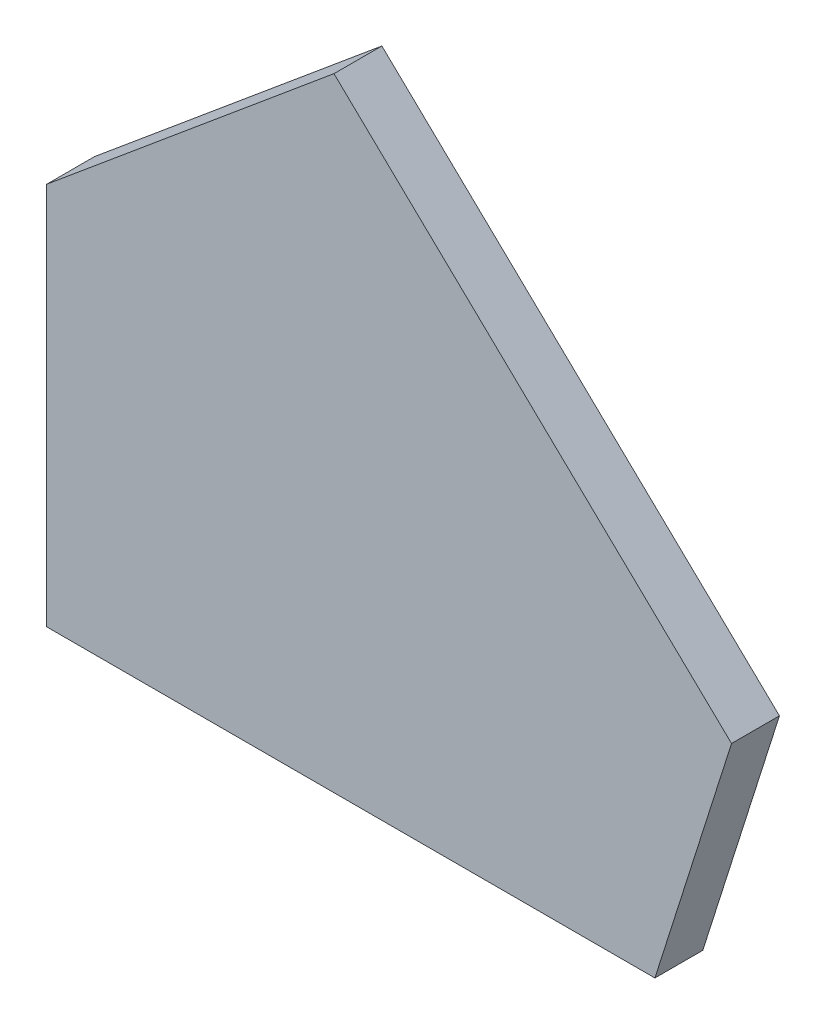
ISO-10303-21;
HEADER;
FILE_DESCRIPTION(('STEP AP214'),'2;1');
FILE_NAME('part.step','',(''),(''),'','','');
FILE_SCHEMA(('AUTOMOTIVE_DESIGN { 1 0 10303 214 1 1 1 1 }'));
ENDSEC;
DATA;
#1=APPLICATION_CONTEXT('core data for automotive mechanical design processes');
#2=APPLICATION_PROTOCOL_DEFINITION('international standard','automotive_design',2000,#1);
#3=PRODUCT_CONTEXT('',#1,'mechanical');
#4=PRODUCT('Part','Part','',(#3));
#5=PRODUCT_RELATED_PRODUCT_CATEGORY('part','',(#4));
#6=PRODUCT_DEFINITION_FORMATION('','',#4);
#7=PRODUCT_DEFINITION_CONTEXT('part definition',#1,'design');
#8=PRODUCT_DEFINITION('design','',#6,#7);
#9=PRODUCT_DEFINITION_SHAPE('','',#8);
#10=(LENGTH_UNIT() NAMED_UNIT(*) SI_UNIT(.MILLI.,.METRE.));
#11=(NAMED_UNIT(*) PLANE_ANGLE_UNIT() SI_UNIT($,.RADIAN.));
#12=(NAMED_UNIT(*) SI_UNIT($,.STERADIAN.) SOLID_ANGLE_UNIT());
#13=UNCERTAINTY_MEASURE_WITH_UNIT(LENGTH_MEASURE(1.E-05),#10,'distance_accuracy_value','');
#14=(GEOMETRIC_REPRESENTATION_CONTEXT(3) GLOBAL_UNCERTAINTY_ASSIGNED_CONTEXT((#13)) GLOBAL_UNIT_ASSIGNED_CONTEXT((#10,
#11,#12)) REPRESENTATION_CONTEXT('',''));
#15=CARTESIAN_POINT('',(0.,0.,0.));
#16=DIRECTION('',(0.,0.,1.));
#17=DIRECTION('',(1.,0.,0.));
#18=AXIS2_PLACEMENT_3D('',#15,#16,#17);
#19=CARTESIAN_POINT('',(-6.35,0.,1.));
#20=DIRECTION('',(1.,0.,0.));
#21=DIRECTION('',(0.,1.,0.));
#22=AXIS2_PLACEMENT_3D('',#19,#20,#21);
#23=PLANE('',#22);
#24=DIRECTION('',(0.,-1.,0.));
#25=VECTOR('',#24,1.);
#26=CARTESIAN_POINT('',(-6.35,0.,0.));
#27=LINE('',#26,#25);
#28=CARTESIAN_POINT('',(-6.35000000000003,7.99999999999998,0.));
#29=VERTEX_POINT('',#28);
#30=CARTESIAN_POINT('',(-6.35,0.,0.));
#31=VERTEX_POINT('',#30);
#32=EDGE_CURVE('E109',#29,#31,#27,.T.);
#33=ORIENTED_EDGE('',*,*,#32,.T.);
#34=DIRECTION('',(0.,0.,-1.));
#35=VECTOR('',#34,1.);
#36=CARTESIAN_POINT('',(-6.35,0.,1.));
#37=LINE('',#36,#35);
#38=CARTESIAN_POINT('',(-6.35,0.,1.));
#39=VERTEX_POINT('',#38);
#40=EDGE_CURVE('E11',#39,#31,#37,.T.);
#41=ORIENTED_EDGE('',*,*,#40,.F.);
#42=DIRECTION('',(0.,-1.,0.));
#43=VECTOR('',#42,1.);
#44=CARTESIAN_POINT('',(-6.35,0.,1.));
#45=LINE('',#44,#43);
#46=CARTESIAN_POINT('',(-6.35000000000003,7.99999999999998,1.));
#47=VERTEX_POINT('',#46);
#48=EDGE_CURVE('E117',#47,#39,#45,.T.);
#49=ORIENTED_EDGE('',*,*,#48,.F.);
#50=DIRECTION('',(0.,0.,-1.));
#51=VECTOR('',#50,1.);
#52=CARTESIAN_POINT('',(-6.35000000000003,7.99999999999998,1.));
#53=LINE('',#52,#51);
#54=EDGE_CURVE('E105',#47,#29,#53,.T.);
#55=ORIENTED_EDGE('',*,*,#54,.T.);
#56=EDGE_LOOP('',(#33,#41,#49,#55));
#57=FACE_BOUND('',#56,.T.);
#58=ADVANCED_FACE('F35',(#57),#23,.F.);
#59=CARTESIAN_POINT('',(-6.35,0.,1.));
#60=DIRECTION('',(0.,1.,0.));
#61=DIRECTION('',(-1.,0.,0.));
#62=AXIS2_PLACEMENT_3D('',#59,#60,#61);
#63=PLANE('',#62);
#64=DIRECTION('',(1.,0.,0.));
#65=VECTOR('',#64,1.);
#66=CARTESIAN_POINT('',(-6.35,0.,0.));
#67=LINE('',#66,#65);
#68=CARTESIAN_POINT('',(6.35,0.,0.));
#69=VERTEX_POINT('',#68);
#70=EDGE_CURVE('E112',#31,#69,#67,.T.);
#71=ORIENTED_EDGE('',*,*,#70,.T.);
#72=DIRECTION('',(0.,0.,-1.));
#73=VECTOR('',#72,1.);
#74=CARTESIAN_POINT('',(6.35,0.,1.));
#75=LINE('',#74,#73);
#76=CARTESIAN_POINT('',(6.35,0.,1.));
#77=VERTEX_POINT('',#76);
#78=EDGE_CURVE('E43',#77,#69,#75,.T.);
#79=ORIENTED_EDGE('',*,*,#78,.F.);
#80=DIRECTION('',(1.,0.,0.));
#81=VECTOR('',#80,1.);
#82=CARTESIAN_POINT('',(-6.35,0.,1.));
#83=LINE('',#82,#81);
#84=EDGE_CURVE('E85',#39,#77,#83,.T.);
#85=ORIENTED_EDGE('',*,*,#84,.F.);
#86=ORIENTED_EDGE('',*,*,#40,.T.);
#87=EDGE_LOOP('',(#71,#79,#85,#86));
#88=FACE_BOUND('',#87,.T.);
#89=ADVANCED_FACE('F136',(#88),#63,.F.);
#90=CARTESIAN_POINT('',(7.94999999999999,5.04010050314707,1.));
#91=DIRECTION('',(-0.953126007206841,0.302573651175948,0.));
#92=DIRECTION('',(-0.302573651175948,-0.953126007206841,0.));
#93=AXIS2_PLACEMENT_3D('',#90,#91,#92);
#94=PLANE('',#93);
#95=DIRECTION('',(0.302573651175948,0.953126007206841,0.));
#96=VECTOR('',#95,1.);
#97=CARTESIAN_POINT('',(7.94999999999999,5.04010050314707,0.));
#98=LINE('',#97,#96);
#99=CARTESIAN_POINT('',(7.94999999999999,5.04010050314707,0.));
#100=VERTEX_POINT('',#99);
#101=EDGE_CURVE('E100',#69,#100,#98,.T.);
#102=ORIENTED_EDGE('',*,*,#101,.T.);
#103=DIRECTION('',(0.,0.,-1.));
#104=VECTOR('',#103,1.);
#105=CARTESIAN_POINT('',(7.94999999999999,5.04010050314707,1.));
#106=LINE('',#105,#104);
#107=CARTESIAN_POINT('',(7.94999999999999,5.04010050314707,1.));
#108=VERTEX_POINT('',#107);
#109=EDGE_CURVE('E97',#108,#100,#106,.T.);
#110=ORIENTED_EDGE('',*,*,#109,.F.);
#111=DIRECTION('',(0.302573651175948,0.953126007206841,0.));
#112=VECTOR('',#111,1.);
#113=CARTESIAN_POINT('',(7.94999999999999,5.04010050314707,1.));
#114=LINE('',#113,#112);
#115=EDGE_CURVE('E89',#77,#108,#114,.T.);
#116=ORIENTED_EDGE('',*,*,#115,.F.);
#117=ORIENTED_EDGE('',*,*,#78,.T.);
#118=EDGE_LOOP('',(#102,#110,#116,#117));
#119=FACE_BOUND('',#118,.T.);
#120=ADVANCED_FACE('F98',(#119),#94,.F.);
#121=CARTESIAN_POINT('',(-0.350000000000045,13.,1.));
#122=DIRECTION('',(-0.692165173639385,-0.721739130434785,0.));
#123=DIRECTION('',(0.721739130434785,-0.692165173639385,0.));
#124=AXIS2_PLACEMENT_3D('',#121,#122,#123);
#125=PLANE('',#124);
#126=DIRECTION('',(-0.721739130434785,0.692165173639385,0.));
#127=VECTOR('',#126,1.);
#128=CARTESIAN_POINT('',(-0.350000000000045,13.,0.));
#129=LINE('',#128,#127);
#130=CARTESIAN_POINT('',(-0.350000000000045,13.,0.));
#131=VERTEX_POINT('',#130);
#132=EDGE_CURVE('E71',#100,#131,#129,.T.);
#133=ORIENTED_EDGE('',*,*,#132,.T.);
#134=DIRECTION('',(0.,0.,-1.));
#135=VECTOR('',#134,1.);
#136=CARTESIAN_POINT('',(-0.350000000000045,13.,1.));
#137=LINE('',#136,#135);
#138=CARTESIAN_POINT('',(-0.350000000000045,13.,1.));
#139=VERTEX_POINT('',#138);
#140=EDGE_CURVE('E101',#139,#131,#137,.T.);
#141=ORIENTED_EDGE('',*,*,#140,.F.);
#142=DIRECTION('',(-0.721739130434785,0.692165173639385,0.));
#143=VECTOR('',#142,1.);
#144=CARTESIAN_POINT('',(-0.350000000000045,13.,1.));
#145=LINE('',#144,#143);
#146=EDGE_CURVE('E93',#108,#139,#145,.T.);
#147=ORIENTED_EDGE('',*,*,#146,.F.);
#148=ORIENTED_EDGE('',*,*,#109,.T.);
#149=EDGE_LOOP('',(#133,#141,#147,#148));
#150=FACE_BOUND('',#149,.T.);
#151=ADVANCED_FACE('F103',(#150),#125,.F.);
#152=CARTESIAN_POINT('',(-6.35000000000003,7.99999999999998,1.));
#153=DIRECTION('',(0.640184399664483,-0.768221279597374,0.));
#154=DIRECTION('',(0.768221279597374,0.640184399664483,0.));
#155=AXIS2_PLACEMENT_3D('',#152,#153,#154);
#156=PLANE('',#155);
#157=DIRECTION('',(-0.768221279597374,-0.640184399664483,0.));
#158=VECTOR('',#157,1.);
#159=CARTESIAN_POINT('',(-6.35000000000003,7.99999999999998,0.));
#160=LINE('',#159,#158);
#161=EDGE_CURVE('E77',#131,#29,#160,.T.);
#162=ORIENTED_EDGE('',*,*,#161,.T.);
#163=ORIENTED_EDGE('',*,*,#54,.F.);
#164=DIRECTION('',(-0.768221279597374,-0.640184399664483,0.));
#165=VECTOR('',#164,1.);
#166=CARTESIAN_POINT('',(-6.35000000000003,7.99999999999998,1.));
#167=LINE('',#166,#165);
#168=EDGE_CURVE('E51',#139,#47,#167,.T.);
#169=ORIENTED_EDGE('',*,*,#168,.F.);
#170=ORIENTED_EDGE('',*,*,#140,.T.);
#171=EDGE_LOOP('',(#162,#163,#169,#170));
#172=FACE_BOUND('',#171,.T.);
#173=ADVANCED_FACE('F125',(#172),#156,.F.);
#174=CARTESIAN_POINT('',(0.,0.,1.));
#175=DIRECTION('',(0.,0.,-1.));
#176=DIRECTION('',(-1.,0.,0.));
#177=AXIS2_PLACEMENT_3D('',#174,#175,#176);
#178=PLANE('',#177);
#179=ORIENTED_EDGE('',*,*,#48,.T.);
#180=ORIENTED_EDGE('',*,*,#84,.T.);
#181=ORIENTED_EDGE('',*,*,#115,.T.);
#182=ORIENTED_EDGE('',*,*,#146,.T.);
#183=ORIENTED_EDGE('',*,*,#168,.T.);
#184=EDGE_LOOP('',(#179,#180,#181,#182,#183));
#185=FACE_BOUND('',#184,.T.);
#186=ADVANCED_FACE('F91',(#185),#178,.F.);
#187=CARTESIAN_POINT('',(0.,0.,0.));
#188=DIRECTION('',(0.,0.,-1.));
#189=DIRECTION('',(-1.,0.,0.));
#190=AXIS2_PLACEMENT_3D('',#187,#188,#189);
#191=PLANE('',#190);
#192=ORIENTED_EDGE('',*,*,#32,.F.);
#193=ORIENTED_EDGE('',*,*,#161,.F.);
#194=ORIENTED_EDGE('',*,*,#132,.F.);
#195=ORIENTED_EDGE('',*,*,#101,.F.);
#196=ORIENTED_EDGE('',*,*,#70,.F.);
#197=EDGE_LOOP('',(#192,#193,#194,#195,#196));
#198=FACE_BOUND('',#197,.T.);
#199=ADVANCED_FACE('F121',(#198),#191,.T.);
#200=CLOSED_SHELL('',(#58,#89,#120,#151,#173,#186,#199));
#201=MANIFOLD_SOLID_BREP('B2',#200);
#202=ADVANCED_BREP_SHAPE_REPRESENTATION('',(#18,#201),#14);
#203=SHAPE_DEFINITION_REPRESENTATION(#9,#202);
ENDSEC;
END-ISO-10303-21;
